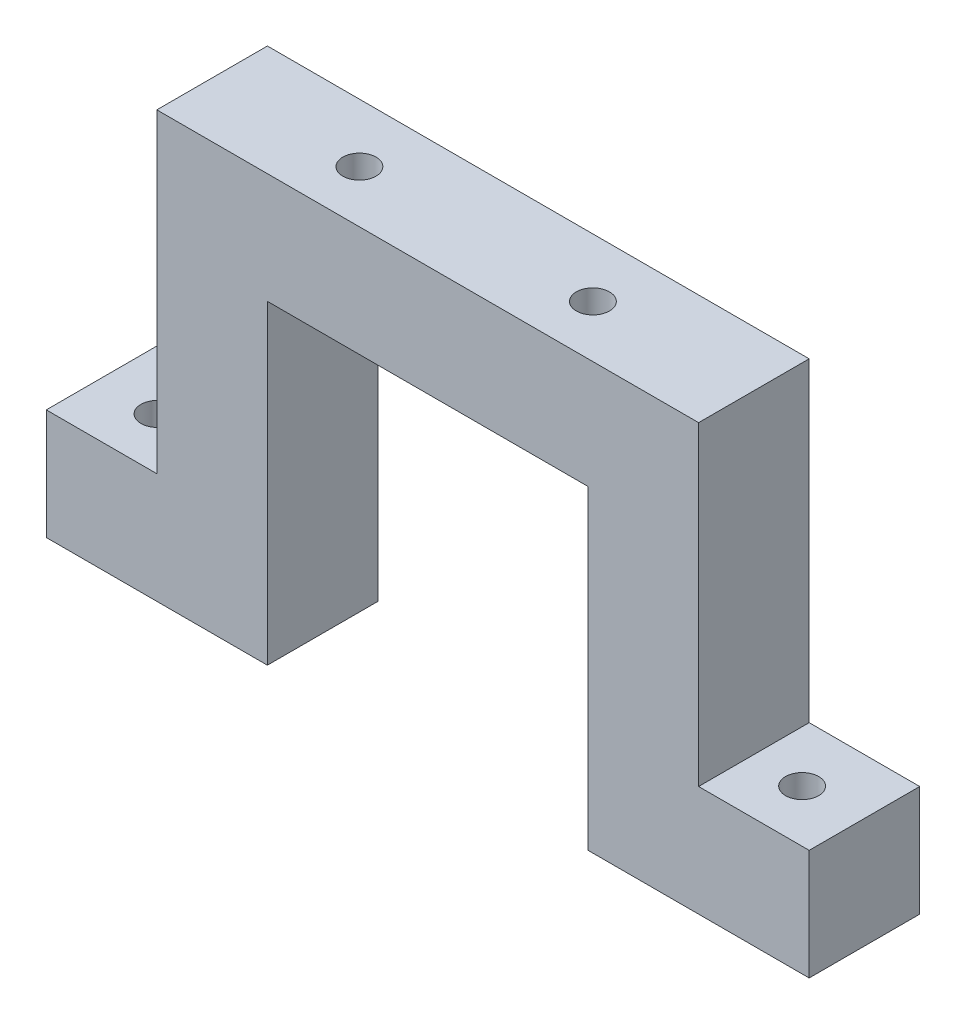
ISO-10303-21;
HEADER;
FILE_DESCRIPTION(('STEP AP214'),'2;1');
FILE_NAME('part.step','',(''),(''),'','','');
FILE_SCHEMA(('AUTOMOTIVE_DESIGN { 1 0 10303 214 1 1 1 1 }'));
ENDSEC;
DATA;
#1=APPLICATION_CONTEXT('core data for automotive mechanical design processes');
#2=APPLICATION_PROTOCOL_DEFINITION('international standard','automotive_design',2000,#1);
#3=PRODUCT_CONTEXT('',#1,'mechanical');
#4=PRODUCT('Part','Part','',(#3));
#5=PRODUCT_RELATED_PRODUCT_CATEGORY('part','',(#4));
#6=PRODUCT_DEFINITION_FORMATION('','',#4);
#7=PRODUCT_DEFINITION_CONTEXT('part definition',#1,'design');
#8=PRODUCT_DEFINITION('design','',#6,#7);
#9=PRODUCT_DEFINITION_SHAPE('','',#8);
#10=(LENGTH_UNIT() NAMED_UNIT(*) SI_UNIT(.MILLI.,.METRE.));
#11=(NAMED_UNIT(*) PLANE_ANGLE_UNIT() SI_UNIT($,.RADIAN.));
#12=(NAMED_UNIT(*) SI_UNIT($,.STERADIAN.) SOLID_ANGLE_UNIT());
#13=UNCERTAINTY_MEASURE_WITH_UNIT(LENGTH_MEASURE(1.E-05),#10,'distance_accuracy_value','');
#14=(GEOMETRIC_REPRESENTATION_CONTEXT(3) GLOBAL_UNCERTAINTY_ASSIGNED_CONTEXT((#13)) GLOBAL_UNIT_ASSIGNED_CONTEXT((#10,
#11,#12)) REPRESENTATION_CONTEXT('',''));
#15=CARTESIAN_POINT('',(0.,0.,0.));
#16=DIRECTION('',(0.,0.,1.));
#17=DIRECTION('',(1.,0.,0.));
#18=AXIS2_PLACEMENT_3D('',#15,#16,#17);
#19=CARTESIAN_POINT('',(59.,-10.,10.));
#20=DIRECTION('',(0.,1.,0.));
#21=DIRECTION('',(-1.,0.,0.));
#22=AXIS2_PLACEMENT_3D('',#19,#20,#21);
#23=PLANE('',#22);
#24=CARTESIAN_POINT('',(63.65,-10.,5.28712453313673));
#25=DIRECTION('',(0.,1.,0.));
#26=DIRECTION('',(-1.,0.,0.));
#27=AXIS2_PLACEMENT_3D('',#24,#25,#26);
#28=CIRCLE('',#27,1.5);
#29=CARTESIAN_POINT('',(62.15,-10.,5.28712453313673));
#30=VERTEX_POINT('',#29);
#31=EDGE_CURVE('E165',#30,#30,#28,.T.);
#32=ORIENTED_EDGE('',*,*,#31,.T.);
#33=EDGE_LOOP('',(#32));
#34=FACE_BOUND('',#33,.T.);
#35=DIRECTION('',(1.,0.,0.));
#36=VECTOR('',#35,1.);
#37=CARTESIAN_POINT('',(59.,-10.,0.));
#38=LINE('',#37,#36);
#39=CARTESIAN_POINT('',(49.,-10.,0.));
#40=VERTEX_POINT('',#39);
#41=CARTESIAN_POINT('',(69.,-10.,0.));
#42=VERTEX_POINT('',#41);
#43=EDGE_CURVE('E161',#40,#42,#38,.T.);
#44=ORIENTED_EDGE('',*,*,#43,.T.);
#45=DIRECTION('',(0.,0.,-1.));
#46=VECTOR('',#45,1.);
#47=CARTESIAN_POINT('',(69.,-10.,10.));
#48=LINE('',#47,#46);
#49=CARTESIAN_POINT('',(69.,-10.,10.));
#50=VERTEX_POINT('',#49);
#51=EDGE_CURVE('E11',#50,#42,#48,.T.);
#52=ORIENTED_EDGE('',*,*,#51,.F.);
#53=DIRECTION('',(1.,0.,0.));
#54=VECTOR('',#53,1.);
#55=CARTESIAN_POINT('',(59.,-10.,10.));
#56=LINE('',#55,#54);
#57=CARTESIAN_POINT('',(49.,-10.,10.));
#58=VERTEX_POINT('',#57);
#59=EDGE_CURVE('E109',#58,#50,#56,.T.);
#60=ORIENTED_EDGE('',*,*,#59,.F.);
#61=DIRECTION('',(0.,0.,-1.));
#62=VECTOR('',#61,1.);
#63=CARTESIAN_POINT('',(49.,-10.,10.));
#64=LINE('',#63,#62);
#65=EDGE_CURVE('E157',#58,#40,#64,.T.);
#66=ORIENTED_EDGE('',*,*,#65,.T.);
#67=EDGE_LOOP('',(#44,#52,#60,#66));
#68=FACE_BOUND('',#67,.T.);
#69=ADVANCED_FACE('F39',(#34,#68),#23,.F.);
#70=CARTESIAN_POINT('',(69.,0.,10.));
#71=DIRECTION('',(1.,0.,0.));
#72=DIRECTION('',(0.,0.,-1.));
#73=AXIS2_PLACEMENT_3D('',#70,#71,#72);
#74=PLANE('',#73);
#75=DIRECTION('',(0.,-1.,0.));
#76=VECTOR('',#75,1.);
#77=CARTESIAN_POINT('',(69.,0.,0.));
#78=LINE('',#77,#76);
#79=CARTESIAN_POINT('',(69.,0.,0.));
#80=VERTEX_POINT('',#79);
#81=EDGE_CURVE('E164',#80,#42,#78,.T.);
#82=ORIENTED_EDGE('',*,*,#81,.F.);
#83=DIRECTION('',(0.,0.,-1.));
#84=VECTOR('',#83,1.);
#85=CARTESIAN_POINT('',(69.,0.,10.));
#86=LINE('',#85,#84);
#87=CARTESIAN_POINT('',(69.,0.,10.));
#88=VERTEX_POINT('',#87);
#89=EDGE_CURVE('E48',#88,#80,#86,.T.);
#90=ORIENTED_EDGE('',*,*,#89,.F.);
#91=DIRECTION('',(0.,-1.,0.));
#92=VECTOR('',#91,1.);
#93=CARTESIAN_POINT('',(69.,0.,10.));
#94=LINE('',#93,#92);
#95=EDGE_CURVE('E230',#88,#50,#94,.T.);
#96=ORIENTED_EDGE('',*,*,#95,.T.);
#97=ORIENTED_EDGE('',*,*,#51,.T.);
#98=EDGE_LOOP('',(#82,#90,#96,#97));
#99=FACE_BOUND('',#98,.T.);
#100=ADVANCED_FACE('F277',(#99),#74,.T.);
#101=CARTESIAN_POINT('',(59.,0.,10.));
#102=DIRECTION('',(0.,1.,0.));
#103=DIRECTION('',(-1.,0.,0.));
#104=AXIS2_PLACEMENT_3D('',#101,#102,#103);
#105=PLANE('',#104);
#106=CARTESIAN_POINT('',(63.65,0.,5.28712453313673));
#107=DIRECTION('',(0.,1.,0.));
#108=DIRECTION('',(-1.,0.,0.));
#109=AXIS2_PLACEMENT_3D('',#106,#107,#108);
#110=CIRCLE('',#109,1.5);
#111=CARTESIAN_POINT('',(62.15,0.,5.28712453313673));
#112=VERTEX_POINT('',#111);
#113=EDGE_CURVE('E42',#112,#112,#110,.T.);
#114=ORIENTED_EDGE('',*,*,#113,.F.);
#115=EDGE_LOOP('',(#114));
#116=FACE_BOUND('',#115,.T.);
#117=DIRECTION('',(1.,0.,0.));
#118=VECTOR('',#117,1.);
#119=CARTESIAN_POINT('',(59.,0.,0.));
#120=LINE('',#119,#118);
#121=CARTESIAN_POINT('',(59.,0.,0.));
#122=VERTEX_POINT('',#121);
#123=EDGE_CURVE('E168',#122,#80,#120,.T.);
#124=ORIENTED_EDGE('',*,*,#123,.F.);
#125=DIRECTION('',(0.,0.,-1.));
#126=VECTOR('',#125,1.);
#127=CARTESIAN_POINT('',(59.,0.,10.));
#128=LINE('',#127,#126);
#129=CARTESIAN_POINT('',(59.,0.,10.));
#130=VERTEX_POINT('',#129);
#131=EDGE_CURVE('E204',#130,#122,#128,.T.);
#132=ORIENTED_EDGE('',*,*,#131,.F.);
#133=DIRECTION('',(1.,0.,0.));
#134=VECTOR('',#133,1.);
#135=CARTESIAN_POINT('',(59.,0.,10.));
#136=LINE('',#135,#134);
#137=EDGE_CURVE('E233',#130,#88,#136,.T.);
#138=ORIENTED_EDGE('',*,*,#137,.T.);
#139=ORIENTED_EDGE('',*,*,#89,.T.);
#140=EDGE_LOOP('',(#124,#132,#138,#139));
#141=FACE_BOUND('',#140,.T.);
#142=ADVANCED_FACE('F284',(#116,#141),#105,.T.);
#143=CARTESIAN_POINT('',(59.,28.5,10.));
#144=DIRECTION('',(1.,0.,0.));
#145=DIRECTION('',(0.,1.,0.));
#146=AXIS2_PLACEMENT_3D('',#143,#144,#145);
#147=PLANE('',#146);
#148=DIRECTION('',(0.,-1.,0.));
#149=VECTOR('',#148,1.);
#150=CARTESIAN_POINT('',(59.,28.5,0.));
#151=LINE('',#150,#149);
#152=CARTESIAN_POINT('',(59.,28.5,0.));
#153=VERTEX_POINT('',#152);
#154=EDGE_CURVE('E171',#153,#122,#151,.T.);
#155=ORIENTED_EDGE('',*,*,#154,.F.);
#156=DIRECTION('',(0.,0.,-1.));
#157=VECTOR('',#156,1.);
#158=CARTESIAN_POINT('',(59.,28.5,10.));
#159=LINE('',#158,#157);
#160=CARTESIAN_POINT('',(59.,28.5,10.));
#161=VERTEX_POINT('',#160);
#162=EDGE_CURVE('E202',#161,#153,#159,.T.);
#163=ORIENTED_EDGE('',*,*,#162,.F.);
#164=DIRECTION('',(0.,-1.,0.));
#165=VECTOR('',#164,1.);
#166=CARTESIAN_POINT('',(59.,28.5,10.));
#167=LINE('',#166,#165);
#168=EDGE_CURVE('E236',#161,#130,#167,.T.);
#169=ORIENTED_EDGE('',*,*,#168,.T.);
#170=ORIENTED_EDGE('',*,*,#131,.T.);
#171=EDGE_LOOP('',(#155,#163,#169,#170));
#172=FACE_BOUND('',#171,.T.);
#173=ADVANCED_FACE('F295',(#172),#147,.T.);
#174=CARTESIAN_POINT('',(10.,28.5,10.));
#175=DIRECTION('',(0.,1.,0.));
#176=DIRECTION('',(0.,0.,1.));
#177=AXIS2_PLACEMENT_3D('',#174,#175,#176);
#178=PLANE('',#177);
#179=CARTESIAN_POINT('',(44.7257028207755,28.5,5.28712453313673));
#180=DIRECTION('',(0.,1.,0.));
#181=DIRECTION('',(0.,0.,1.));
#182=AXIS2_PLACEMENT_3D('',#179,#180,#181);
#183=CIRCLE('',#182,1.5);
#184=CARTESIAN_POINT('',(44.7257028207755,28.5,6.78712453313674));
#185=VERTEX_POINT('',#184);
#186=EDGE_CURVE('E213',#185,#185,#183,.T.);
#187=ORIENTED_EDGE('',*,*,#186,.F.);
#188=EDGE_LOOP('',(#187));
#189=FACE_BOUND('',#188,.T.);
#190=CARTESIAN_POINT('',(23.6099872958206,28.5,5.28712453313673));
#191=DIRECTION('',(0.,1.,0.));
#192=DIRECTION('',(0.,0.,1.));
#193=AXIS2_PLACEMENT_3D('',#190,#191,#192);
#194=CIRCLE('',#193,1.5);
#195=CARTESIAN_POINT('',(23.6099872958206,28.5,6.78712453313673));
#196=VERTEX_POINT('',#195);
#197=EDGE_CURVE('E210',#196,#196,#194,.T.);
#198=ORIENTED_EDGE('',*,*,#197,.F.);
#199=EDGE_LOOP('',(#198));
#200=FACE_BOUND('',#199,.T.);
#201=DIRECTION('',(1.,0.,0.));
#202=VECTOR('',#201,1.);
#203=CARTESIAN_POINT('',(10.,28.5,0.));
#204=LINE('',#203,#202);
#205=CARTESIAN_POINT('',(10.,28.5,0.));
#206=VERTEX_POINT('',#205);
#207=EDGE_CURVE('E174',#206,#153,#204,.T.);
#208=ORIENTED_EDGE('',*,*,#207,.F.);
#209=DIRECTION('',(0.,0.,-1.));
#210=VECTOR('',#209,1.);
#211=CARTESIAN_POINT('',(10.,28.5,10.));
#212=LINE('',#211,#210);
#213=CARTESIAN_POINT('',(10.,28.5,10.));
#214=VERTEX_POINT('',#213);
#215=EDGE_CURVE('E200',#214,#206,#212,.T.);
#216=ORIENTED_EDGE('',*,*,#215,.F.);
#217=DIRECTION('',(1.,0.,0.));
#218=VECTOR('',#217,1.);
#219=CARTESIAN_POINT('',(10.,28.5,10.));
#220=LINE('',#219,#218);
#221=EDGE_CURVE('E239',#214,#161,#220,.T.);
#222=ORIENTED_EDGE('',*,*,#221,.T.);
#223=ORIENTED_EDGE('',*,*,#162,.T.);
#224=EDGE_LOOP('',(#208,#216,#222,#223));
#225=FACE_BOUND('',#224,.T.);
#226=ADVANCED_FACE('F298',(#189,#200,#225),#178,.T.);
#227=CARTESIAN_POINT('',(10.,0.,10.));
#228=DIRECTION('',(-1.,0.,0.));
#229=DIRECTION('',(0.,0.,1.));
#230=AXIS2_PLACEMENT_3D('',#227,#228,#229);
#231=PLANE('',#230);
#232=DIRECTION('',(0.,1.,0.));
#233=VECTOR('',#232,1.);
#234=CARTESIAN_POINT('',(10.,0.,0.));
#235=LINE('',#234,#233);
#236=CARTESIAN_POINT('',(10.,0.,0.));
#237=VERTEX_POINT('',#236);
#238=EDGE_CURVE('E177',#237,#206,#235,.T.);
#239=ORIENTED_EDGE('',*,*,#238,.F.);
#240=DIRECTION('',(0.,0.,-1.));
#241=VECTOR('',#240,1.);
#242=CARTESIAN_POINT('',(10.,0.,10.));
#243=LINE('',#242,#241);
#244=CARTESIAN_POINT('',(10.,0.,10.));
#245=VERTEX_POINT('',#244);
#246=EDGE_CURVE('E198',#245,#237,#243,.T.);
#247=ORIENTED_EDGE('',*,*,#246,.F.);
#248=DIRECTION('',(0.,1.,0.));
#249=VECTOR('',#248,1.);
#250=CARTESIAN_POINT('',(10.,0.,10.));
#251=LINE('',#250,#249);
#252=EDGE_CURVE('E242',#245,#214,#251,.T.);
#253=ORIENTED_EDGE('',*,*,#252,.T.);
#254=ORIENTED_EDGE('',*,*,#215,.T.);
#255=EDGE_LOOP('',(#239,#247,#253,#254));
#256=FACE_BOUND('',#255,.T.);
#257=ADVANCED_FACE('F300',(#256),#231,.T.);
#258=CARTESIAN_POINT('',(0.,0.,10.));
#259=DIRECTION('',(0.,1.,0.));
#260=DIRECTION('',(0.,0.,1.));
#261=AXIS2_PLACEMENT_3D('',#258,#259,#260);
#262=PLANE('',#261);
#263=CARTESIAN_POINT('',(5.34788965045685,0.,5.28712453313673));
#264=DIRECTION('',(0.,1.,0.));
#265=DIRECTION('',(0.,0.,1.));
#266=AXIS2_PLACEMENT_3D('',#263,#264,#265);
#267=CIRCLE('',#266,1.5);
#268=CARTESIAN_POINT('',(5.34788965045685,0.,6.78712453313673));
#269=VERTEX_POINT('',#268);
#270=EDGE_CURVE('E216',#269,#269,#267,.T.);
#271=ORIENTED_EDGE('',*,*,#270,.F.);
#272=EDGE_LOOP('',(#271));
#273=FACE_BOUND('',#272,.T.);
#274=DIRECTION('',(1.,0.,0.));
#275=VECTOR('',#274,1.);
#276=CARTESIAN_POINT('',(0.,0.,0.));
#277=LINE('',#276,#275);
#278=CARTESIAN_POINT('',(0.,0.,0.));
#279=VERTEX_POINT('',#278);
#280=EDGE_CURVE('E180',#279,#237,#277,.T.);
#281=ORIENTED_EDGE('',*,*,#280,.F.);
#282=DIRECTION('',(0.,0.,-1.));
#283=VECTOR('',#282,1.);
#284=CARTESIAN_POINT('',(0.,0.,10.));
#285=LINE('',#284,#283);
#286=CARTESIAN_POINT('',(0.,0.,10.));
#287=VERTEX_POINT('',#286);
#288=EDGE_CURVE('E196',#287,#279,#285,.T.);
#289=ORIENTED_EDGE('',*,*,#288,.F.);
#290=DIRECTION('',(1.,0.,0.));
#291=VECTOR('',#290,1.);
#292=CARTESIAN_POINT('',(0.,0.,10.));
#293=LINE('',#292,#291);
#294=EDGE_CURVE('E245',#287,#245,#293,.T.);
#295=ORIENTED_EDGE('',*,*,#294,.T.);
#296=ORIENTED_EDGE('',*,*,#246,.T.);
#297=EDGE_LOOP('',(#281,#289,#295,#296));
#298=FACE_BOUND('',#297,.T.);
#299=ADVANCED_FACE('F258',(#273,#298),#262,.T.);
#300=CARTESIAN_POINT('',(0.,-10.,10.));
#301=DIRECTION('',(-1.,0.,0.));
#302=DIRECTION('',(0.,0.,1.));
#303=AXIS2_PLACEMENT_3D('',#300,#301,#302);
#304=PLANE('',#303);
#305=DIRECTION('',(0.,1.,0.));
#306=VECTOR('',#305,1.);
#307=CARTESIAN_POINT('',(0.,-10.,0.));
#308=LINE('',#307,#306);
#309=CARTESIAN_POINT('',(0.,-10.,0.));
#310=VERTEX_POINT('',#309);
#311=EDGE_CURVE('E183',#310,#279,#308,.T.);
#312=ORIENTED_EDGE('',*,*,#311,.F.);
#313=DIRECTION('',(0.,0.,-1.));
#314=VECTOR('',#313,1.);
#315=CARTESIAN_POINT('',(0.,-10.,10.));
#316=LINE('',#315,#314);
#317=CARTESIAN_POINT('',(0.,-10.,10.));
#318=VERTEX_POINT('',#317);
#319=EDGE_CURVE('E194',#318,#310,#316,.T.);
#320=ORIENTED_EDGE('',*,*,#319,.F.);
#321=DIRECTION('',(0.,1.,0.));
#322=VECTOR('',#321,1.);
#323=CARTESIAN_POINT('',(0.,-10.,10.));
#324=LINE('',#323,#322);
#325=EDGE_CURVE('E248',#318,#287,#324,.T.);
#326=ORIENTED_EDGE('',*,*,#325,.T.);
#327=ORIENTED_EDGE('',*,*,#288,.T.);
#328=EDGE_LOOP('',(#312,#320,#326,#327));
#329=FACE_BOUND('',#328,.T.);
#330=ADVANCED_FACE('F252',(#329),#304,.T.);
#331=CARTESIAN_POINT('',(0.,-10.,10.));
#332=DIRECTION('',(0.,1.,0.));
#333=DIRECTION('',(0.,0.,1.));
#334=AXIS2_PLACEMENT_3D('',#331,#332,#333);
#335=PLANE('',#334);
#336=CARTESIAN_POINT('',(5.34788965045685,-10.,5.28712453313673));
#337=DIRECTION('',(0.,1.,0.));
#338=DIRECTION('',(0.,0.,1.));
#339=AXIS2_PLACEMENT_3D('',#336,#337,#338);
#340=CIRCLE('',#339,1.5);
#341=CARTESIAN_POINT('',(5.34788965045685,-10.,6.78712453313673));
#342=VERTEX_POINT('',#341);
#343=EDGE_CURVE('E214',#342,#342,#340,.T.);
#344=ORIENTED_EDGE('',*,*,#343,.T.);
#345=EDGE_LOOP('',(#344));
#346=FACE_BOUND('',#345,.T.);
#347=DIRECTION('',(1.,0.,0.));
#348=VECTOR('',#347,1.);
#349=CARTESIAN_POINT('',(0.,-10.,0.));
#350=LINE('',#349,#348);
#351=CARTESIAN_POINT('',(20.,-10.,0.));
#352=VERTEX_POINT('',#351);
#353=EDGE_CURVE('E186',#310,#352,#350,.T.);
#354=ORIENTED_EDGE('',*,*,#353,.T.);
#355=DIRECTION('',(0.,0.,-1.));
#356=VECTOR('',#355,1.);
#357=CARTESIAN_POINT('',(20.,-10.,10.));
#358=LINE('',#357,#356);
#359=CARTESIAN_POINT('',(20.,-10.,10.));
#360=VERTEX_POINT('',#359);
#361=EDGE_CURVE('E152',#360,#352,#358,.T.);
#362=ORIENTED_EDGE('',*,*,#361,.F.);
#363=DIRECTION('',(1.,0.,0.));
#364=VECTOR('',#363,1.);
#365=CARTESIAN_POINT('',(0.,-10.,10.));
#366=LINE('',#365,#364);
#367=EDGE_CURVE('E143',#318,#360,#366,.T.);
#368=ORIENTED_EDGE('',*,*,#367,.F.);
#369=ORIENTED_EDGE('',*,*,#319,.T.);
#370=EDGE_LOOP('',(#354,#362,#368,#369));
#371=FACE_BOUND('',#370,.T.);
#372=ADVANCED_FACE('F265',(#346,#371),#335,.F.);
#373=CARTESIAN_POINT('',(20.,0.,10.));
#374=DIRECTION('',(-1.,0.,0.));
#375=DIRECTION('',(0.,0.,1.));
#376=AXIS2_PLACEMENT_3D('',#373,#374,#375);
#377=PLANE('',#376);
#378=DIRECTION('',(0.,1.,0.));
#379=VECTOR('',#378,1.);
#380=CARTESIAN_POINT('',(20.,0.,0.));
#381=LINE('',#380,#379);
#382=CARTESIAN_POINT('',(20.,18.5,0.));
#383=VERTEX_POINT('',#382);
#384=EDGE_CURVE('E151',#352,#383,#381,.T.);
#385=ORIENTED_EDGE('',*,*,#384,.T.);
#386=DIRECTION('',(0.,0.,-1.));
#387=VECTOR('',#386,1.);
#388=CARTESIAN_POINT('',(20.,18.5,10.));
#389=LINE('',#388,#387);
#390=CARTESIAN_POINT('',(20.,18.5,10.));
#391=VERTEX_POINT('',#390);
#392=EDGE_CURVE('E148',#391,#383,#389,.T.);
#393=ORIENTED_EDGE('',*,*,#392,.F.);
#394=DIRECTION('',(0.,1.,0.));
#395=VECTOR('',#394,1.);
#396=CARTESIAN_POINT('',(20.,0.,10.));
#397=LINE('',#396,#395);
#398=EDGE_CURVE('E136',#360,#391,#397,.T.);
#399=ORIENTED_EDGE('',*,*,#398,.F.);
#400=ORIENTED_EDGE('',*,*,#361,.T.);
#401=EDGE_LOOP('',(#385,#393,#399,#400));
#402=FACE_BOUND('',#401,.T.);
#403=ADVANCED_FACE('F149',(#402),#377,.F.);
#404=CARTESIAN_POINT('',(10.,18.5,10.));
#405=DIRECTION('',(0.,1.,0.));
#406=DIRECTION('',(0.,0.,1.));
#407=AXIS2_PLACEMENT_3D('',#404,#405,#406);
#408=PLANE('',#407);
#409=CARTESIAN_POINT('',(44.7257028207755,18.5,5.28712453313673));
#410=DIRECTION('',(0.,1.,0.));
#411=DIRECTION('',(0.,0.,1.));
#412=AXIS2_PLACEMENT_3D('',#409,#410,#411);
#413=CIRCLE('',#412,1.5);
#414=CARTESIAN_POINT('',(44.7257028207755,18.5,6.78712453313674));
#415=VERTEX_POINT('',#414);
#416=EDGE_CURVE('E211',#415,#415,#413,.T.);
#417=ORIENTED_EDGE('',*,*,#416,.T.);
#418=EDGE_LOOP('',(#417));
#419=FACE_BOUND('',#418,.T.);
#420=CARTESIAN_POINT('',(23.6099872958206,18.5,5.28712453313673));
#421=DIRECTION('',(0.,1.,0.));
#422=DIRECTION('',(0.,0.,1.));
#423=AXIS2_PLACEMENT_3D('',#420,#421,#422);
#424=CIRCLE('',#423,1.5);
#425=CARTESIAN_POINT('',(23.6099872958206,18.5,6.78712453313673));
#426=VERTEX_POINT('',#425);
#427=EDGE_CURVE('E207',#426,#426,#424,.T.);
#428=ORIENTED_EDGE('',*,*,#427,.T.);
#429=EDGE_LOOP('',(#428));
#430=FACE_BOUND('',#429,.T.);
#431=DIRECTION('',(1.,0.,0.));
#432=VECTOR('',#431,1.);
#433=CARTESIAN_POINT('',(10.,18.5,0.));
#434=LINE('',#433,#432);
#435=CARTESIAN_POINT('',(49.,18.5,0.));
#436=VERTEX_POINT('',#435);
#437=EDGE_CURVE('E97',#383,#436,#434,.T.);
#438=ORIENTED_EDGE('',*,*,#437,.T.);
#439=DIRECTION('',(0.,0.,-1.));
#440=VECTOR('',#439,1.);
#441=CARTESIAN_POINT('',(49.,18.5,10.));
#442=LINE('',#441,#440);
#443=CARTESIAN_POINT('',(49.,18.5,10.));
#444=VERTEX_POINT('',#443);
#445=EDGE_CURVE('E153',#444,#436,#442,.T.);
#446=ORIENTED_EDGE('',*,*,#445,.F.);
#447=DIRECTION('',(1.,0.,0.));
#448=VECTOR('',#447,1.);
#449=CARTESIAN_POINT('',(10.,18.5,10.));
#450=LINE('',#449,#448);
#451=EDGE_CURVE('E140',#391,#444,#450,.T.);
#452=ORIENTED_EDGE('',*,*,#451,.F.);
#453=ORIENTED_EDGE('',*,*,#392,.T.);
#454=EDGE_LOOP('',(#438,#446,#452,#453));
#455=FACE_BOUND('',#454,.T.);
#456=ADVANCED_FACE('F155',(#419,#430,#455),#408,.F.);
#457=CARTESIAN_POINT('',(49.,28.5,10.));
#458=DIRECTION('',(1.,0.,0.));
#459=DIRECTION('',(0.,1.,0.));
#460=AXIS2_PLACEMENT_3D('',#457,#458,#459);
#461=PLANE('',#460);
#462=DIRECTION('',(0.,-1.,0.));
#463=VECTOR('',#462,1.);
#464=CARTESIAN_POINT('',(49.,28.5,0.));
#465=LINE('',#464,#463);
#466=EDGE_CURVE('E103',#436,#40,#465,.T.);
#467=ORIENTED_EDGE('',*,*,#466,.T.);
#468=ORIENTED_EDGE('',*,*,#65,.F.);
#469=DIRECTION('',(0.,-1.,0.));
#470=VECTOR('',#469,1.);
#471=CARTESIAN_POINT('',(49.,28.5,10.));
#472=LINE('',#471,#470);
#473=EDGE_CURVE('E57',#444,#58,#472,.T.);
#474=ORIENTED_EDGE('',*,*,#473,.F.);
#475=ORIENTED_EDGE('',*,*,#445,.T.);
#476=EDGE_LOOP('',(#467,#468,#474,#475));
#477=FACE_BOUND('',#476,.T.);
#478=ADVANCED_FACE('F338',(#477),#461,.F.);
#479=CARTESIAN_POINT('',(0.,0.,10.));
#480=DIRECTION('',(0.,0.,-1.));
#481=DIRECTION('',(-1.,0.,0.));
#482=AXIS2_PLACEMENT_3D('',#479,#480,#481);
#483=PLANE('',#482);
#484=ORIENTED_EDGE('',*,*,#59,.T.);
#485=ORIENTED_EDGE('',*,*,#95,.F.);
#486=ORIENTED_EDGE('',*,*,#137,.F.);
#487=ORIENTED_EDGE('',*,*,#168,.F.);
#488=ORIENTED_EDGE('',*,*,#221,.F.);
#489=ORIENTED_EDGE('',*,*,#252,.F.);
#490=ORIENTED_EDGE('',*,*,#294,.F.);
#491=ORIENTED_EDGE('',*,*,#325,.F.);
#492=ORIENTED_EDGE('',*,*,#367,.T.);
#493=ORIENTED_EDGE('',*,*,#398,.T.);
#494=ORIENTED_EDGE('',*,*,#451,.T.);
#495=ORIENTED_EDGE('',*,*,#473,.T.);
#496=EDGE_LOOP('',(#484,#485,#486,#487,#488,#489,#490,#491,#492,#493,#494,#495));
#497=FACE_BOUND('',#496,.T.);
#498=ADVANCED_FACE('F138',(#497),#483,.F.);
#499=CARTESIAN_POINT('',(0.,0.,0.));
#500=DIRECTION('',(0.,0.,-1.));
#501=DIRECTION('',(-1.,0.,0.));
#502=AXIS2_PLACEMENT_3D('',#499,#500,#501);
#503=PLANE('',#502);
#504=ORIENTED_EDGE('',*,*,#43,.F.);
#505=ORIENTED_EDGE('',*,*,#466,.F.);
#506=ORIENTED_EDGE('',*,*,#437,.F.);
#507=ORIENTED_EDGE('',*,*,#384,.F.);
#508=ORIENTED_EDGE('',*,*,#353,.F.);
#509=ORIENTED_EDGE('',*,*,#311,.T.);
#510=ORIENTED_EDGE('',*,*,#280,.T.);
#511=ORIENTED_EDGE('',*,*,#238,.T.);
#512=ORIENTED_EDGE('',*,*,#207,.T.);
#513=ORIENTED_EDGE('',*,*,#154,.T.);
#514=ORIENTED_EDGE('',*,*,#123,.T.);
#515=ORIENTED_EDGE('',*,*,#81,.T.);
#516=EDGE_LOOP('',(#504,#505,#506,#507,#508,#509,#510,#511,#512,#513,#514,#515));
#517=FACE_BOUND('',#516,.T.);
#518=ADVANCED_FACE('F263',(#517),#503,.T.);
#519=CARTESIAN_POINT('',(23.6099872958206,-45.,5.28712453313673));
#520=DIRECTION('',(0.,1.,0.));
#521=DIRECTION('',(0.,0.,1.));
#522=AXIS2_PLACEMENT_3D('',#519,#520,#521);
#523=CYLINDRICAL_SURFACE('',#522,1.5);
#524=ORIENTED_EDGE('',*,*,#197,.T.);
#525=EDGE_LOOP('',(#524));
#526=FACE_BOUND('',#525,.T.);
#527=ORIENTED_EDGE('',*,*,#427,.F.);
#528=EDGE_LOOP('',(#527));
#529=FACE_BOUND('',#528,.T.);
#530=ADVANCED_FACE('F332',(#526,#529),#523,.F.);
#531=CARTESIAN_POINT('',(44.7257028207755,-45.,5.28712453313673));
#532=DIRECTION('',(0.,1.,0.));
#533=DIRECTION('',(0.,0.,1.));
#534=AXIS2_PLACEMENT_3D('',#531,#532,#533);
#535=CYLINDRICAL_SURFACE('',#534,1.5);
#536=ORIENTED_EDGE('',*,*,#186,.T.);
#537=EDGE_LOOP('',(#536));
#538=FACE_BOUND('',#537,.T.);
#539=ORIENTED_EDGE('',*,*,#416,.F.);
#540=EDGE_LOOP('',(#539));
#541=FACE_BOUND('',#540,.T.);
#542=ADVANCED_FACE('F327',(#538,#541),#535,.F.);
#543=CARTESIAN_POINT('',(5.34788965045685,-45.,5.28712453313673));
#544=DIRECTION('',(0.,1.,0.));
#545=DIRECTION('',(0.,0.,1.));
#546=AXIS2_PLACEMENT_3D('',#543,#544,#545);
#547=CYLINDRICAL_SURFACE('',#546,1.5);
#548=ORIENTED_EDGE('',*,*,#270,.T.);
#549=EDGE_LOOP('',(#548));
#550=FACE_BOUND('',#549,.T.);
#551=ORIENTED_EDGE('',*,*,#343,.F.);
#552=EDGE_LOOP('',(#551));
#553=FACE_BOUND('',#552,.T.);
#554=ADVANCED_FACE('F322',(#550,#553),#547,.F.);
#555=CARTESIAN_POINT('',(63.65,-45.,5.28712453313673));
#556=DIRECTION('',(0.,1.,0.));
#557=DIRECTION('',(0.,0.,1.));
#558=AXIS2_PLACEMENT_3D('',#555,#556,#557);
#559=CYLINDRICAL_SURFACE('',#558,1.5);
#560=ORIENTED_EDGE('',*,*,#113,.T.);
#561=EDGE_LOOP('',(#560));
#562=FACE_BOUND('',#561,.T.);
#563=ORIENTED_EDGE('',*,*,#31,.F.);
#564=EDGE_LOOP('',(#563));
#565=FACE_BOUND('',#564,.T.);
#566=ADVANCED_FACE('F319',(#562,#565),#559,.F.);
#567=CLOSED_SHELL('',(#69,#100,#142,#173,#226,#257,#299,#330,#372,#403,#456,#478,#498,#518,#530,
#542,#554,#566));
#568=MANIFOLD_SOLID_BREP('B2',#567);
#569=ADVANCED_BREP_SHAPE_REPRESENTATION('',(#18,#568),#14);
#570=SHAPE_DEFINITION_REPRESENTATION(#9,#569);
ENDSEC;
END-ISO-10303-21;
